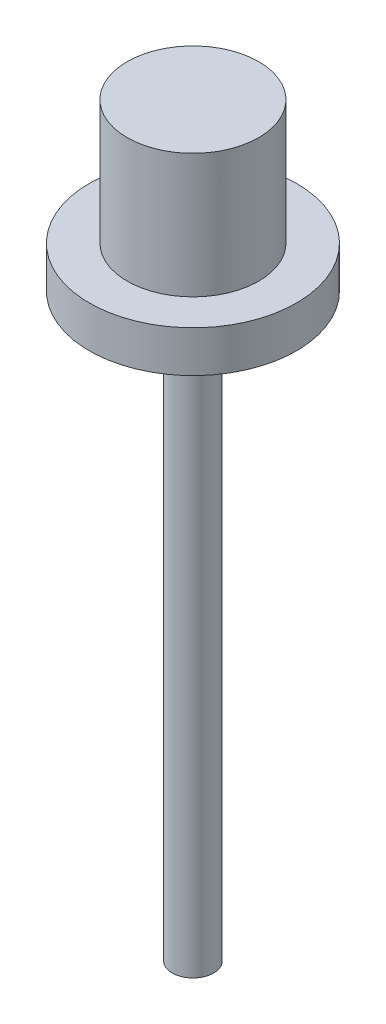
ISO-10303-21;
HEADER;
FILE_DESCRIPTION(('STEP AP214'),'2;1');
FILE_NAME('part.step','',(''),(''),'','','');
FILE_SCHEMA(('AUTOMOTIVE_DESIGN { 1 0 10303 214 1 1 1 1 }'));
ENDSEC;
DATA;
#1=APPLICATION_CONTEXT('core data for automotive mechanical design processes');
#2=APPLICATION_PROTOCOL_DEFINITION('international standard','automotive_design',2000,#1);
#3=PRODUCT_CONTEXT('',#1,'mechanical');
#4=PRODUCT('Part','Part','',(#3));
#5=PRODUCT_RELATED_PRODUCT_CATEGORY('part','',(#4));
#6=PRODUCT_DEFINITION_FORMATION('','',#4);
#7=PRODUCT_DEFINITION_CONTEXT('part definition',#1,'design');
#8=PRODUCT_DEFINITION('design','',#6,#7);
#9=PRODUCT_DEFINITION_SHAPE('','',#8);
#10=(LENGTH_UNIT() NAMED_UNIT(*) SI_UNIT(.MILLI.,.METRE.));
#11=(NAMED_UNIT(*) PLANE_ANGLE_UNIT() SI_UNIT($,.RADIAN.));
#12=(NAMED_UNIT(*) SI_UNIT($,.STERADIAN.) SOLID_ANGLE_UNIT());
#13=UNCERTAINTY_MEASURE_WITH_UNIT(LENGTH_MEASURE(1.E-05),#10,'distance_accuracy_value','');
#14=(GEOMETRIC_REPRESENTATION_CONTEXT(3) GLOBAL_UNCERTAINTY_ASSIGNED_CONTEXT((#13)) GLOBAL_UNIT_ASSIGNED_CONTEXT((#10,
#11,#12)) REPRESENTATION_CONTEXT('',''));
#15=CARTESIAN_POINT('',(0.,0.,0.));
#16=DIRECTION('',(0.,0.,1.));
#17=DIRECTION('',(1.,0.,0.));
#18=AXIS2_PLACEMENT_3D('',#15,#16,#17);
#19=CARTESIAN_POINT('',(0.,6.,0.));
#20=DIRECTION('',(0.,-1.,0.));
#21=DIRECTION('',(0.,0.,-1.));
#22=AXIS2_PLACEMENT_3D('',#19,#20,#21);
#23=CYLINDRICAL_SURFACE('',#22,3.175);
#24=CARTESIAN_POINT('',(0.,6.,0.));
#25=DIRECTION('',(0.,1.,0.));
#26=DIRECTION('',(0.,0.,1.));
#27=AXIS2_PLACEMENT_3D('',#24,#25,#26);
#28=CIRCLE('',#27,3.175);
#29=CARTESIAN_POINT('',(0.,6.,3.175));
#30=VERTEX_POINT('',#29);
#31=EDGE_CURVE('E10',#30,#30,#28,.T.);
#32=ORIENTED_EDGE('',*,*,#31,.F.);
#33=EDGE_LOOP('',(#32));
#34=FACE_BOUND('',#33,.T.);
#35=CARTESIAN_POINT('',(0.,0.,0.));
#36=DIRECTION('',(0.,-1.,0.));
#37=DIRECTION('',(0.,0.,-1.));
#38=AXIS2_PLACEMENT_3D('',#35,#36,#37);
#39=CIRCLE('',#38,3.175);
#40=CARTESIAN_POINT('',(0.,0.,-3.175));
#41=VERTEX_POINT('',#40);
#42=EDGE_CURVE('E46',#41,#41,#39,.T.);
#43=ORIENTED_EDGE('',*,*,#42,.F.);
#44=EDGE_LOOP('',(#43));
#45=FACE_BOUND('',#44,.T.);
#46=ADVANCED_FACE('F33',(#34,#45),#23,.T.);
#47=CARTESIAN_POINT('',(0.,6.,0.));
#48=DIRECTION('',(0.,1.,0.));
#49=DIRECTION('',(0.,0.,1.));
#50=AXIS2_PLACEMENT_3D('',#47,#48,#49);
#51=PLANE('',#50);
#52=ORIENTED_EDGE('',*,*,#31,.T.);
#53=EDGE_LOOP('',(#52));
#54=FACE_BOUND('',#53,.T.);
#55=ADVANCED_FACE('F61',(#54),#51,.T.);
#56=CARTESIAN_POINT('',(0.,-2.,0.));
#57=DIRECTION('',(0.,1.,0.));
#58=DIRECTION('',(0.,0.,1.));
#59=AXIS2_PLACEMENT_3D('',#56,#57,#58);
#60=CYLINDRICAL_SURFACE('',#59,5.);
#61=CARTESIAN_POINT('',(0.,-2.,0.));
#62=DIRECTION('',(0.,-1.,0.));
#63=DIRECTION('',(0.,0.,-1.));
#64=AXIS2_PLACEMENT_3D('',#61,#62,#63);
#65=CIRCLE('',#64,5.);
#66=CARTESIAN_POINT('',(0.,-2.,-5.));
#67=VERTEX_POINT('',#66);
#68=EDGE_CURVE('E49',#67,#67,#65,.T.);
#69=ORIENTED_EDGE('',*,*,#68,.F.);
#70=EDGE_LOOP('',(#69));
#71=FACE_BOUND('',#70,.T.);
#72=CARTESIAN_POINT('',(0.,0.,0.));
#73=DIRECTION('',(0.,-1.,0.));
#74=DIRECTION('',(0.,0.,-1.));
#75=AXIS2_PLACEMENT_3D('',#72,#73,#74);
#76=CIRCLE('',#75,5.);
#77=CARTESIAN_POINT('',(0.,0.,-5.));
#78=VERTEX_POINT('',#77);
#79=EDGE_CURVE('E50',#78,#78,#76,.T.);
#80=ORIENTED_EDGE('',*,*,#79,.T.);
#81=EDGE_LOOP('',(#80));
#82=FACE_BOUND('',#81,.T.);
#83=ADVANCED_FACE('F58',(#71,#82),#60,.T.);
#84=CARTESIAN_POINT('',(0.,-2.,0.));
#85=DIRECTION('',(0.,-1.,0.));
#86=DIRECTION('',(0.,0.,-1.));
#87=AXIS2_PLACEMENT_3D('',#84,#85,#86);
#88=PLANE('',#87);
#89=CARTESIAN_POINT('',(0.,-2.,0.));
#90=DIRECTION('',(0.,-1.,0.));
#91=DIRECTION('',(0.,0.,-1.));
#92=AXIS2_PLACEMENT_3D('',#89,#90,#91);
#93=CIRCLE('',#92,1.);
#94=CARTESIAN_POINT('',(0.,-2.,-1.));
#95=VERTEX_POINT('',#94);
#96=EDGE_CURVE('E36',#95,#95,#93,.T.);
#97=ORIENTED_EDGE('',*,*,#96,.F.);
#98=EDGE_LOOP('',(#97));
#99=FACE_BOUND('',#98,.T.);
#100=ORIENTED_EDGE('',*,*,#68,.T.);
#101=EDGE_LOOP('',(#100));
#102=FACE_BOUND('',#101,.T.);
#103=ADVANCED_FACE('F56',(#99,#102),#88,.T.);
#104=CARTESIAN_POINT('',(0.,0.,0.));
#105=DIRECTION('',(0.,-1.,0.));
#106=DIRECTION('',(0.,0.,-1.));
#107=AXIS2_PLACEMENT_3D('',#104,#105,#106);
#108=PLANE('',#107);
#109=ORIENTED_EDGE('',*,*,#42,.T.);
#110=EDGE_LOOP('',(#109));
#111=FACE_BOUND('',#110,.T.);
#112=ORIENTED_EDGE('',*,*,#79,.F.);
#113=EDGE_LOOP('',(#112));
#114=FACE_BOUND('',#113,.T.);
#115=ADVANCED_FACE('F65',(#111,#114),#108,.F.);
#116=CARTESIAN_POINT('',(0.,-30.,0.));
#117=DIRECTION('',(0.,-1.,0.));
#118=DIRECTION('',(0.,0.,-1.));
#119=AXIS2_PLACEMENT_3D('',#116,#117,#118);
#120=PLANE('',#119);
#121=CARTESIAN_POINT('',(0.,-30.,0.));
#122=DIRECTION('',(0.,-1.,0.));
#123=DIRECTION('',(0.,0.,-1.));
#124=AXIS2_PLACEMENT_3D('',#121,#122,#123);
#125=CIRCLE('',#124,1.);
#126=CARTESIAN_POINT('',(0.,-30.,-1.));
#127=VERTEX_POINT('',#126);
#128=EDGE_CURVE('E40',#127,#127,#125,.T.);
#129=ORIENTED_EDGE('',*,*,#128,.T.);
#130=EDGE_LOOP('',(#129));
#131=FACE_BOUND('',#130,.T.);
#132=ADVANCED_FACE('F67',(#131),#120,.T.);
#133=CARTESIAN_POINT('',(0.,-30.,0.));
#134=DIRECTION('',(0.,1.,0.));
#135=DIRECTION('',(0.,0.,1.));
#136=AXIS2_PLACEMENT_3D('',#133,#134,#135);
#137=CYLINDRICAL_SURFACE('',#136,1.);
#138=ORIENTED_EDGE('',*,*,#96,.T.);
#139=EDGE_LOOP('',(#138));
#140=FACE_BOUND('',#139,.T.);
#141=ORIENTED_EDGE('',*,*,#128,.F.);
#142=EDGE_LOOP('',(#141));
#143=FACE_BOUND('',#142,.T.);
#144=ADVANCED_FACE('F74',(#140,#143),#137,.T.);
#145=CLOSED_SHELL('',(#46,#55,#83,#103,#115,#132,#144));
#146=MANIFOLD_SOLID_BREP('B2',#145);
#147=ADVANCED_BREP_SHAPE_REPRESENTATION('',(#18,#146),#14);
#148=SHAPE_DEFINITION_REPRESENTATION(#9,#147);
ENDSEC;
END-ISO-10303-21;
